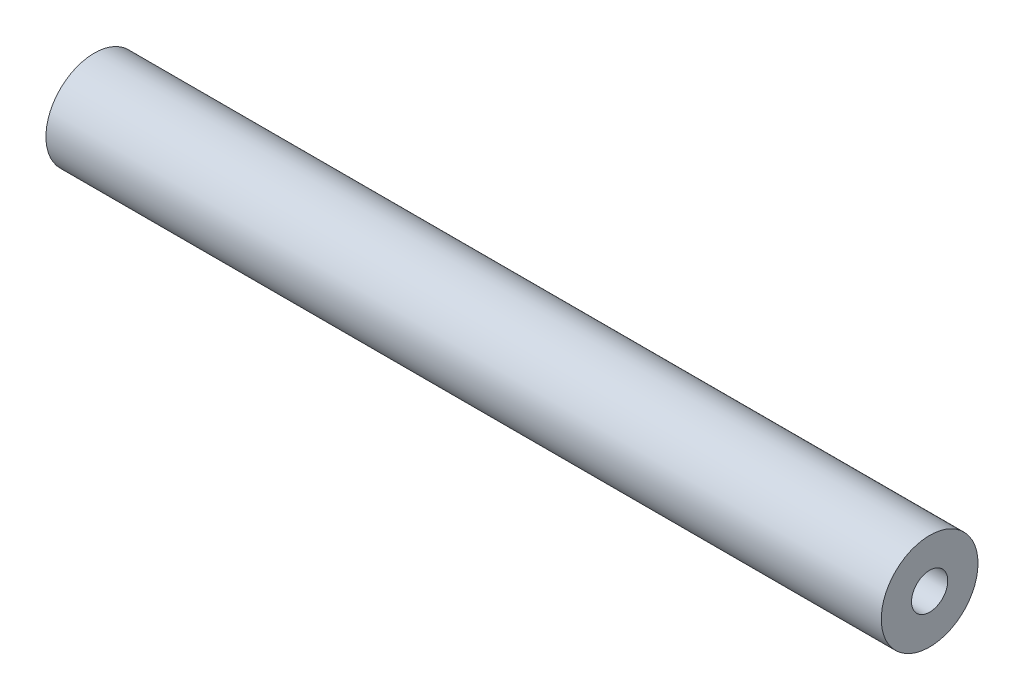
ISO-10303-21;
HEADER;
FILE_DESCRIPTION(('STEP AP214'),'2;1');
FILE_NAME('part.step','',(''),(''),'','','');
FILE_SCHEMA(('AUTOMOTIVE_DESIGN { 1 0 10303 214 1 1 1 1 }'));
ENDSEC;
DATA;
#1=APPLICATION_CONTEXT('core data for automotive mechanical design processes');
#2=APPLICATION_PROTOCOL_DEFINITION('international standard','automotive_design',2000,#1);
#3=PRODUCT_CONTEXT('',#1,'mechanical');
#4=PRODUCT('Part','Part','',(#3));
#5=PRODUCT_RELATED_PRODUCT_CATEGORY('part','',(#4));
#6=PRODUCT_DEFINITION_FORMATION('','',#4);
#7=PRODUCT_DEFINITION_CONTEXT('part definition',#1,'design');
#8=PRODUCT_DEFINITION('design','',#6,#7);
#9=PRODUCT_DEFINITION_SHAPE('','',#8);
#10=(LENGTH_UNIT() NAMED_UNIT(*) SI_UNIT(.MILLI.,.METRE.));
#11=(NAMED_UNIT(*) PLANE_ANGLE_UNIT() SI_UNIT($,.RADIAN.));
#12=(NAMED_UNIT(*) SI_UNIT($,.STERADIAN.) SOLID_ANGLE_UNIT());
#13=UNCERTAINTY_MEASURE_WITH_UNIT(LENGTH_MEASURE(1.E-05),#10,'distance_accuracy_value','');
#14=(GEOMETRIC_REPRESENTATION_CONTEXT(3) GLOBAL_UNCERTAINTY_ASSIGNED_CONTEXT((#13)) GLOBAL_UNIT_ASSIGNED_CONTEXT((#10,
#11,#12)) REPRESENTATION_CONTEXT('',''));
#15=CARTESIAN_POINT('',(0.,0.,0.));
#16=DIRECTION('',(0.,0.,1.));
#17=DIRECTION('',(1.,0.,0.));
#18=AXIS2_PLACEMENT_3D('',#15,#16,#17);
#19=CARTESIAN_POINT('',(69.09,0.,0.));
#20=DIRECTION('',(-1.,0.,0.));
#21=DIRECTION('',(0.,0.,1.));
#22=AXIS2_PLACEMENT_3D('',#19,#20,#21);
#23=CYLINDRICAL_SURFACE('',#22,4.);
#24=CARTESIAN_POINT('',(69.09,0.,0.));
#25=DIRECTION('',(1.,0.,0.));
#26=DIRECTION('',(0.,0.,-1.));
#27=AXIS2_PLACEMENT_3D('',#24,#25,#26);
#28=CIRCLE('',#27,4.);
#29=CARTESIAN_POINT('',(69.09,0.,-4.));
#30=VERTEX_POINT('',#29);
#31=EDGE_CURVE('E10',#30,#30,#28,.T.);
#32=ORIENTED_EDGE('',*,*,#31,.F.);
#33=EDGE_LOOP('',(#32));
#34=FACE_BOUND('',#33,.T.);
#35=CARTESIAN_POINT('',(0.,0.,0.));
#36=DIRECTION('',(1.,0.,0.));
#37=DIRECTION('',(0.,0.,-1.));
#38=AXIS2_PLACEMENT_3D('',#35,#36,#37);
#39=CIRCLE('',#38,4.);
#40=CARTESIAN_POINT('',(0.,0.,-4.));
#41=VERTEX_POINT('',#40);
#42=EDGE_CURVE('E40',#41,#41,#39,.T.);
#43=ORIENTED_EDGE('',*,*,#42,.T.);
#44=EDGE_LOOP('',(#43));
#45=FACE_BOUND('',#44,.T.);
#46=ADVANCED_FACE('F37',(#34,#45),#23,.T.);
#47=CARTESIAN_POINT('',(69.09,0.,0.));
#48=DIRECTION('',(1.,0.,0.));
#49=DIRECTION('',(0.,0.,-1.));
#50=AXIS2_PLACEMENT_3D('',#47,#48,#49);
#51=PLANE('',#50);
#52=CARTESIAN_POINT('',(69.09,0.,0.));
#53=DIRECTION('',(-1.,0.,0.));
#54=DIRECTION('',(0.,0.,1.));
#55=AXIS2_PLACEMENT_3D('',#52,#53,#54);
#56=CIRCLE('',#55,1.5);
#57=CARTESIAN_POINT('',(69.09,0.,1.5));
#58=VERTEX_POINT('',#57);
#59=EDGE_CURVE('E47',#58,#58,#56,.T.);
#60=ORIENTED_EDGE('',*,*,#59,.T.);
#61=EDGE_LOOP('',(#60));
#62=FACE_BOUND('',#61,.T.);
#63=ORIENTED_EDGE('',*,*,#31,.T.);
#64=EDGE_LOOP('',(#63));
#65=FACE_BOUND('',#64,.T.);
#66=ADVANCED_FACE('F55',(#62,#65),#51,.T.);
#67=CARTESIAN_POINT('',(0.,0.,0.));
#68=DIRECTION('',(1.,0.,0.));
#69=DIRECTION('',(0.,0.,-1.));
#70=AXIS2_PLACEMENT_3D('',#67,#68,#69);
#71=PLANE('',#70);
#72=CARTESIAN_POINT('',(0.,0.,0.));
#73=DIRECTION('',(-1.,0.,0.));
#74=DIRECTION('',(0.,0.,1.));
#75=AXIS2_PLACEMENT_3D('',#72,#73,#74);
#76=CIRCLE('',#75,1.5);
#77=CARTESIAN_POINT('',(0.,0.,1.5));
#78=VERTEX_POINT('',#77);
#79=EDGE_CURVE('E49',#78,#78,#76,.T.);
#80=ORIENTED_EDGE('',*,*,#79,.F.);
#81=EDGE_LOOP('',(#80));
#82=FACE_BOUND('',#81,.T.);
#83=ORIENTED_EDGE('',*,*,#42,.F.);
#84=EDGE_LOOP('',(#83));
#85=FACE_BOUND('',#84,.T.);
#86=ADVANCED_FACE('F60',(#82,#85),#71,.F.);
#87=CARTESIAN_POINT('',(69.09,0.,0.));
#88=DIRECTION('',(-1.,0.,0.));
#89=DIRECTION('',(0.,0.,1.));
#90=AXIS2_PLACEMENT_3D('',#87,#88,#89);
#91=CYLINDRICAL_SURFACE('',#90,1.5);
#92=ORIENTED_EDGE('',*,*,#59,.F.);
#93=EDGE_LOOP('',(#92));
#94=FACE_BOUND('',#93,.T.);
#95=ORIENTED_EDGE('',*,*,#79,.T.);
#96=EDGE_LOOP('',(#95));
#97=FACE_BOUND('',#96,.T.);
#98=ADVANCED_FACE('F57',(#94,#97),#91,.F.);
#99=CLOSED_SHELL('',(#46,#66,#86,#98));
#100=MANIFOLD_SOLID_BREP('B2',#99);
#101=ADVANCED_BREP_SHAPE_REPRESENTATION('',(#18,#100),#14);
#102=SHAPE_DEFINITION_REPRESENTATION(#9,#101);
ENDSEC;
END-ISO-10303-21;
